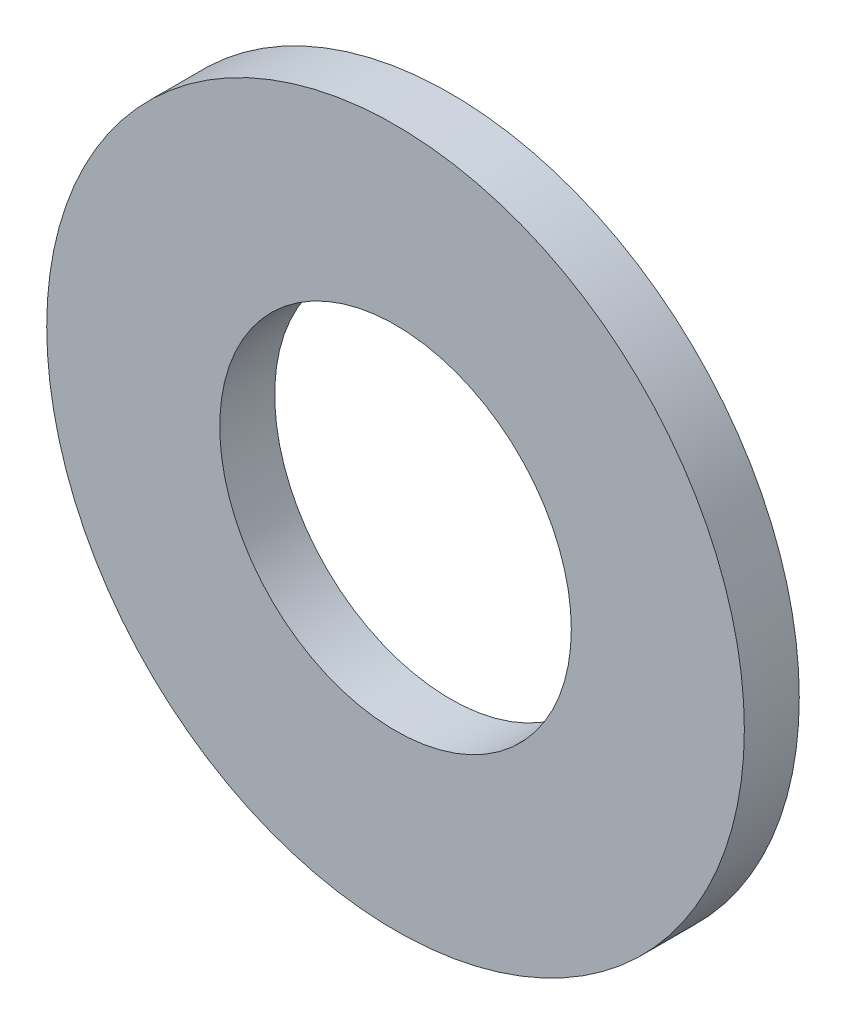
ISO-10303-21;
HEADER;
FILE_DESCRIPTION(('STEP AP214'),'2;1');
FILE_NAME('part.step','',(''),(''),'','','');
FILE_SCHEMA(('AUTOMOTIVE_DESIGN { 1 0 10303 214 1 1 1 1 }'));
ENDSEC;
DATA;
#1=APPLICATION_CONTEXT('core data for automotive mechanical design processes');
#2=APPLICATION_PROTOCOL_DEFINITION('international standard','automotive_design',2000,#1);
#3=PRODUCT_CONTEXT('',#1,'mechanical');
#4=PRODUCT('Part','Part','',(#3));
#5=PRODUCT_RELATED_PRODUCT_CATEGORY('part','',(#4));
#6=PRODUCT_DEFINITION_FORMATION('','',#4);
#7=PRODUCT_DEFINITION_CONTEXT('part definition',#1,'design');
#8=PRODUCT_DEFINITION('design','',#6,#7);
#9=PRODUCT_DEFINITION_SHAPE('','',#8);
#10=(LENGTH_UNIT() NAMED_UNIT(*) SI_UNIT(.MILLI.,.METRE.));
#11=(NAMED_UNIT(*) PLANE_ANGLE_UNIT() SI_UNIT($,.RADIAN.));
#12=(NAMED_UNIT(*) SI_UNIT($,.STERADIAN.) SOLID_ANGLE_UNIT());
#13=UNCERTAINTY_MEASURE_WITH_UNIT(LENGTH_MEASURE(1.E-05),#10,'distance_accuracy_value','');
#14=(GEOMETRIC_REPRESENTATION_CONTEXT(3) GLOBAL_UNCERTAINTY_ASSIGNED_CONTEXT((#13)) GLOBAL_UNIT_ASSIGNED_CONTEXT((#10,
#11,#12)) REPRESENTATION_CONTEXT('',''));
#15=CARTESIAN_POINT('',(0.,0.,0.));
#16=DIRECTION('',(0.,0.,1.));
#17=DIRECTION('',(1.,0.,0.));
#18=AXIS2_PLACEMENT_3D('',#15,#16,#17);
#19=CARTESIAN_POINT('',(0.,0.,-0.5));
#20=DIRECTION('',(0.,0.,1.));
#21=DIRECTION('',(1.,0.,0.));
#22=AXIS2_PLACEMENT_3D('',#19,#20,#21);
#23=CYLINDRICAL_SURFACE('',#22,3.175);
#24=CARTESIAN_POINT('',(0.,0.,-0.5));
#25=DIRECTION('',(0.,0.,1.));
#26=DIRECTION('',(1.,0.,0.));
#27=AXIS2_PLACEMENT_3D('',#24,#25,#26);
#28=CIRCLE('',#27,3.175);
#29=CARTESIAN_POINT('',(3.175,0.,-0.5));
#30=VERTEX_POINT('',#29);
#31=EDGE_CURVE('E10',#30,#30,#28,.T.);
#32=ORIENTED_EDGE('',*,*,#31,.T.);
#33=EDGE_LOOP('',(#32));
#34=FACE_BOUND('',#33,.T.);
#35=CARTESIAN_POINT('',(0.,0.,0.));
#36=DIRECTION('',(0.,0.,1.));
#37=DIRECTION('',(1.,0.,0.));
#38=AXIS2_PLACEMENT_3D('',#35,#36,#37);
#39=CIRCLE('',#38,3.175);
#40=CARTESIAN_POINT('',(3.175,0.,0.));
#41=VERTEX_POINT('',#40);
#42=EDGE_CURVE('E33',#41,#41,#39,.T.);
#43=ORIENTED_EDGE('',*,*,#42,.F.);
#44=EDGE_LOOP('',(#43));
#45=FACE_BOUND('',#44,.T.);
#46=ADVANCED_FACE('F30',(#34,#45),#23,.T.);
#47=CARTESIAN_POINT('',(0.,0.,-0.5));
#48=DIRECTION('',(0.,0.,1.));
#49=DIRECTION('',(1.,0.,0.));
#50=AXIS2_PLACEMENT_3D('',#47,#48,#49);
#51=PLANE('',#50);
#52=CARTESIAN_POINT('',(0.,0.,-0.5));
#53=DIRECTION('',(0.,0.,1.));
#54=DIRECTION('',(1.,0.,0.));
#55=AXIS2_PLACEMENT_3D('',#52,#53,#54);
#56=CIRCLE('',#55,1.6);
#57=CARTESIAN_POINT('',(1.6,0.,-0.5));
#58=VERTEX_POINT('',#57);
#59=EDGE_CURVE('E40',#58,#58,#56,.T.);
#60=ORIENTED_EDGE('',*,*,#59,.T.);
#61=EDGE_LOOP('',(#60));
#62=FACE_BOUND('',#61,.T.);
#63=ORIENTED_EDGE('',*,*,#31,.F.);
#64=EDGE_LOOP('',(#63));
#65=FACE_BOUND('',#64,.T.);
#66=ADVANCED_FACE('F48',(#62,#65),#51,.F.);
#67=CARTESIAN_POINT('',(0.,0.,0.));
#68=DIRECTION('',(0.,0.,1.));
#69=DIRECTION('',(1.,0.,0.));
#70=AXIS2_PLACEMENT_3D('',#67,#68,#69);
#71=PLANE('',#70);
#72=CARTESIAN_POINT('',(0.,0.,0.));
#73=DIRECTION('',(0.,0.,1.));
#74=DIRECTION('',(1.,0.,0.));
#75=AXIS2_PLACEMENT_3D('',#72,#73,#74);
#76=CIRCLE('',#75,1.6);
#77=CARTESIAN_POINT('',(1.6,0.,0.));
#78=VERTEX_POINT('',#77);
#79=EDGE_CURVE('E42',#78,#78,#76,.T.);
#80=ORIENTED_EDGE('',*,*,#79,.F.);
#81=EDGE_LOOP('',(#80));
#82=FACE_BOUND('',#81,.T.);
#83=ORIENTED_EDGE('',*,*,#42,.T.);
#84=EDGE_LOOP('',(#83));
#85=FACE_BOUND('',#84,.T.);
#86=ADVANCED_FACE('F54',(#82,#85),#71,.T.);
#87=CARTESIAN_POINT('',(0.,0.,-0.5));
#88=DIRECTION('',(0.,0.,1.));
#89=DIRECTION('',(1.,0.,0.));
#90=AXIS2_PLACEMENT_3D('',#87,#88,#89);
#91=CYLINDRICAL_SURFACE('',#90,1.6);
#92=ORIENTED_EDGE('',*,*,#59,.F.);
#93=EDGE_LOOP('',(#92));
#94=FACE_BOUND('',#93,.T.);
#95=ORIENTED_EDGE('',*,*,#79,.T.);
#96=EDGE_LOOP('',(#95));
#97=FACE_BOUND('',#96,.T.);
#98=ADVANCED_FACE('F51',(#94,#97),#91,.F.);
#99=CLOSED_SHELL('',(#46,#66,#86,#98));
#100=MANIFOLD_SOLID_BREP('B2',#99);
#101=ADVANCED_BREP_SHAPE_REPRESENTATION('',(#18,#100),#14);
#102=SHAPE_DEFINITION_REPRESENTATION(#9,#101);
ENDSEC;
END-ISO-10303-21;
